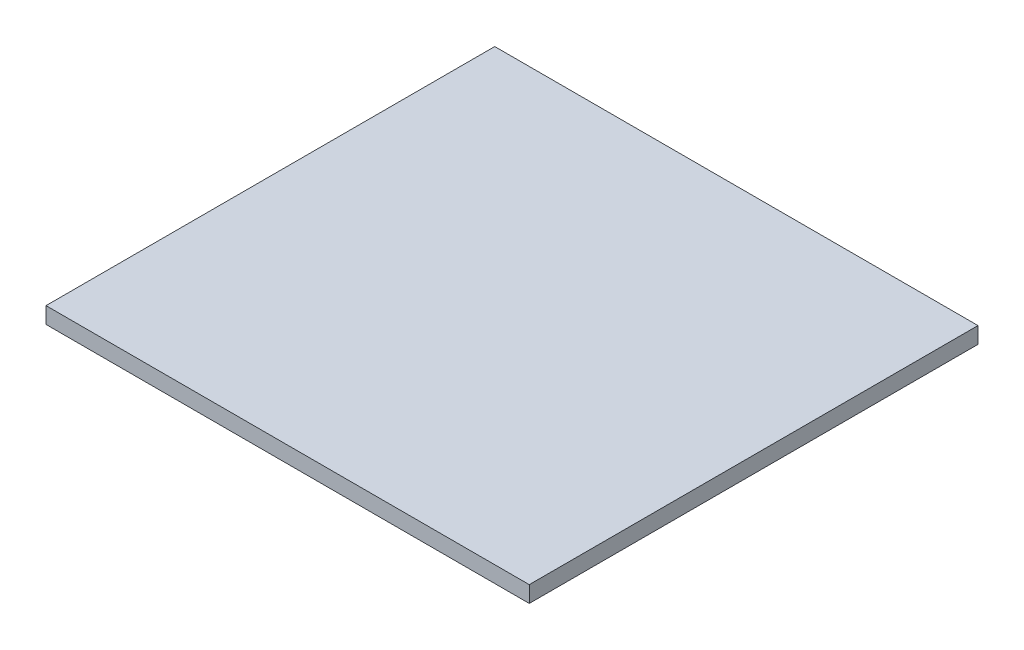
ISO-10303-21;
HEADER;
FILE_DESCRIPTION(('STEP AP214'),'2;1');
FILE_NAME('part.step','',(''),(''),'','','');
FILE_SCHEMA(('AUTOMOTIVE_DESIGN { 1 0 10303 214 1 1 1 1 }'));
ENDSEC;
DATA;
#1=APPLICATION_CONTEXT('core data for automotive mechanical design processes');
#2=APPLICATION_PROTOCOL_DEFINITION('international standard','automotive_design',2000,#1);
#3=PRODUCT_CONTEXT('',#1,'mechanical');
#4=PRODUCT('Part','Part','',(#3));
#5=PRODUCT_RELATED_PRODUCT_CATEGORY('part','',(#4));
#6=PRODUCT_DEFINITION_FORMATION('','',#4);
#7=PRODUCT_DEFINITION_CONTEXT('part definition',#1,'design');
#8=PRODUCT_DEFINITION('design','',#6,#7);
#9=PRODUCT_DEFINITION_SHAPE('','',#8);
#10=(LENGTH_UNIT() NAMED_UNIT(*) SI_UNIT(.MILLI.,.METRE.));
#11=(NAMED_UNIT(*) PLANE_ANGLE_UNIT() SI_UNIT($,.RADIAN.));
#12=(NAMED_UNIT(*) SI_UNIT($,.STERADIAN.) SOLID_ANGLE_UNIT());
#13=UNCERTAINTY_MEASURE_WITH_UNIT(LENGTH_MEASURE(1.E-05),#10,'distance_accuracy_value','');
#14=(GEOMETRIC_REPRESENTATION_CONTEXT(3) GLOBAL_UNCERTAINTY_ASSIGNED_CONTEXT((#13)) GLOBAL_UNIT_ASSIGNED_CONTEXT((#10,
#11,#12)) REPRESENTATION_CONTEXT('',''));
#15=CARTESIAN_POINT('',(0.,0.,0.));
#16=DIRECTION('',(0.,0.,1.));
#17=DIRECTION('',(1.,0.,0.));
#18=AXIS2_PLACEMENT_3D('',#15,#16,#17);
#19=CARTESIAN_POINT('',(-88.8999999999999,6.,82.55));
#20=DIRECTION('',(1.,0.,0.));
#21=DIRECTION('',(0.,0.,-1.));
#22=AXIS2_PLACEMENT_3D('',#19,#20,#21);
#23=PLANE('',#22);
#24=DIRECTION('',(0.,0.,1.));
#25=VECTOR('',#24,1.);
#26=CARTESIAN_POINT('',(-88.8999999999999,0.,82.55));
#27=LINE('',#26,#25);
#28=CARTESIAN_POINT('',(-88.8999999999999,0.,-82.55));
#29=VERTEX_POINT('',#28);
#30=CARTESIAN_POINT('',(-88.8999999999999,0.,82.55));
#31=VERTEX_POINT('',#30);
#32=EDGE_CURVE('E98',#29,#31,#27,.T.);
#33=ORIENTED_EDGE('',*,*,#32,.T.);
#34=DIRECTION('',(0.,-1.,0.));
#35=VECTOR('',#34,1.);
#36=CARTESIAN_POINT('',(-88.8999999999999,6.,82.55));
#37=LINE('',#36,#35);
#38=CARTESIAN_POINT('',(-88.8999999999999,6.,82.55));
#39=VERTEX_POINT('',#38);
#40=EDGE_CURVE('E11',#39,#31,#37,.T.);
#41=ORIENTED_EDGE('',*,*,#40,.F.);
#42=DIRECTION('',(0.,0.,1.));
#43=VECTOR('',#42,1.);
#44=CARTESIAN_POINT('',(-88.8999999999999,6.,82.55));
#45=LINE('',#44,#43);
#46=CARTESIAN_POINT('',(-88.8999999999999,6.,-82.55));
#47=VERTEX_POINT('',#46);
#48=EDGE_CURVE('E86',#47,#39,#45,.T.);
#49=ORIENTED_EDGE('',*,*,#48,.F.);
#50=DIRECTION('',(0.,-1.,0.));
#51=VECTOR('',#50,1.);
#52=CARTESIAN_POINT('',(-88.8999999999999,6.,-82.55));
#53=LINE('',#52,#51);
#54=EDGE_CURVE('E94',#47,#29,#53,.T.);
#55=ORIENTED_EDGE('',*,*,#54,.T.);
#56=EDGE_LOOP('',(#33,#41,#49,#55));
#57=FACE_BOUND('',#56,.T.);
#58=ADVANCED_FACE('F35',(#57),#23,.F.);
#59=CARTESIAN_POINT('',(88.9,6.,82.55));
#60=DIRECTION('',(0.,0.,-1.));
#61=DIRECTION('',(-1.,0.,0.));
#62=AXIS2_PLACEMENT_3D('',#59,#60,#61);
#63=PLANE('',#62);
#64=DIRECTION('',(1.,0.,0.));
#65=VECTOR('',#64,1.);
#66=CARTESIAN_POINT('',(88.9,0.,82.55));
#67=LINE('',#66,#65);
#68=CARTESIAN_POINT('',(88.9,0.,82.55));
#69=VERTEX_POINT('',#68);
#70=EDGE_CURVE('E90',#31,#69,#67,.T.);
#71=ORIENTED_EDGE('',*,*,#70,.T.);
#72=DIRECTION('',(0.,-1.,0.));
#73=VECTOR('',#72,1.);
#74=CARTESIAN_POINT('',(88.9,6.,82.55));
#75=LINE('',#74,#73);
#76=CARTESIAN_POINT('',(88.9,6.,82.55));
#77=VERTEX_POINT('',#76);
#78=EDGE_CURVE('E43',#77,#69,#75,.T.);
#79=ORIENTED_EDGE('',*,*,#78,.F.);
#80=DIRECTION('',(1.,0.,0.));
#81=VECTOR('',#80,1.);
#82=CARTESIAN_POINT('',(88.9,6.,82.55));
#83=LINE('',#82,#81);
#84=EDGE_CURVE('E81',#39,#77,#83,.T.);
#85=ORIENTED_EDGE('',*,*,#84,.F.);
#86=ORIENTED_EDGE('',*,*,#40,.T.);
#87=EDGE_LOOP('',(#71,#79,#85,#86));
#88=FACE_BOUND('',#87,.T.);
#89=ADVANCED_FACE('F89',(#88),#63,.F.);
#90=CARTESIAN_POINT('',(88.9,6.,82.55));
#91=DIRECTION('',(-1.,0.,0.));
#92=DIRECTION('',(0.,0.,1.));
#93=AXIS2_PLACEMENT_3D('',#90,#91,#92);
#94=PLANE('',#93);
#95=DIRECTION('',(0.,0.,-1.));
#96=VECTOR('',#95,1.);
#97=CARTESIAN_POINT('',(88.9,0.,82.55));
#98=LINE('',#97,#96);
#99=CARTESIAN_POINT('',(88.9,0.,-82.55));
#100=VERTEX_POINT('',#99);
#101=EDGE_CURVE('E68',#69,#100,#98,.T.);
#102=ORIENTED_EDGE('',*,*,#101,.T.);
#103=DIRECTION('',(0.,-1.,0.));
#104=VECTOR('',#103,1.);
#105=CARTESIAN_POINT('',(88.9,6.,-82.55));
#106=LINE('',#105,#104);
#107=CARTESIAN_POINT('',(88.9,6.,-82.55));
#108=VERTEX_POINT('',#107);
#109=EDGE_CURVE('E91',#108,#100,#106,.T.);
#110=ORIENTED_EDGE('',*,*,#109,.F.);
#111=DIRECTION('',(0.,0.,-1.));
#112=VECTOR('',#111,1.);
#113=CARTESIAN_POINT('',(88.9,6.,82.55));
#114=LINE('',#113,#112);
#115=EDGE_CURVE('E84',#77,#108,#114,.T.);
#116=ORIENTED_EDGE('',*,*,#115,.F.);
#117=ORIENTED_EDGE('',*,*,#78,.T.);
#118=EDGE_LOOP('',(#102,#110,#116,#117));
#119=FACE_BOUND('',#118,.T.);
#120=ADVANCED_FACE('F92',(#119),#94,.F.);
#121=CARTESIAN_POINT('',(88.9,6.,-82.55));
#122=DIRECTION('',(0.,0.,1.));
#123=DIRECTION('',(1.,0.,0.));
#124=AXIS2_PLACEMENT_3D('',#121,#122,#123);
#125=PLANE('',#124);
#126=DIRECTION('',(-1.,0.,0.));
#127=VECTOR('',#126,1.);
#128=CARTESIAN_POINT('',(88.9,0.,-82.55));
#129=LINE('',#128,#127);
#130=EDGE_CURVE('E74',#100,#29,#129,.T.);
#131=ORIENTED_EDGE('',*,*,#130,.T.);
#132=ORIENTED_EDGE('',*,*,#54,.F.);
#133=DIRECTION('',(-1.,0.,0.));
#134=VECTOR('',#133,1.);
#135=CARTESIAN_POINT('',(88.9,6.,-82.55));
#136=LINE('',#135,#134);
#137=EDGE_CURVE('E51',#108,#47,#136,.T.);
#138=ORIENTED_EDGE('',*,*,#137,.F.);
#139=ORIENTED_EDGE('',*,*,#109,.T.);
#140=EDGE_LOOP('',(#131,#132,#138,#139));
#141=FACE_BOUND('',#140,.T.);
#142=ADVANCED_FACE('F105',(#141),#125,.F.);
#143=CARTESIAN_POINT('',(0.,6.,0.));
#144=DIRECTION('',(0.,1.,0.));
#145=DIRECTION('',(0.,0.,1.));
#146=AXIS2_PLACEMENT_3D('',#143,#144,#145);
#147=PLANE('',#146);
#148=ORIENTED_EDGE('',*,*,#48,.T.);
#149=ORIENTED_EDGE('',*,*,#84,.T.);
#150=ORIENTED_EDGE('',*,*,#115,.T.);
#151=ORIENTED_EDGE('',*,*,#137,.T.);
#152=EDGE_LOOP('',(#148,#149,#150,#151));
#153=FACE_BOUND('',#152,.T.);
#154=ADVANCED_FACE('F82',(#153),#147,.T.);
#155=CARTESIAN_POINT('',(0.,0.,0.));
#156=DIRECTION('',(0.,1.,0.));
#157=DIRECTION('',(0.,0.,1.));
#158=AXIS2_PLACEMENT_3D('',#155,#156,#157);
#159=PLANE('',#158);
#160=ORIENTED_EDGE('',*,*,#32,.F.);
#161=ORIENTED_EDGE('',*,*,#130,.F.);
#162=ORIENTED_EDGE('',*,*,#101,.F.);
#163=ORIENTED_EDGE('',*,*,#70,.F.);
#164=EDGE_LOOP('',(#160,#161,#162,#163));
#165=FACE_BOUND('',#164,.T.);
#166=ADVANCED_FACE('F108',(#165),#159,.F.);
#167=CLOSED_SHELL('',(#58,#89,#120,#142,#154,#166));
#168=MANIFOLD_SOLID_BREP('B2',#167);
#169=ADVANCED_BREP_SHAPE_REPRESENTATION('',(#18,#168),#14);
#170=SHAPE_DEFINITION_REPRESENTATION(#9,#169);
ENDSEC;
END-ISO-10303-21;
